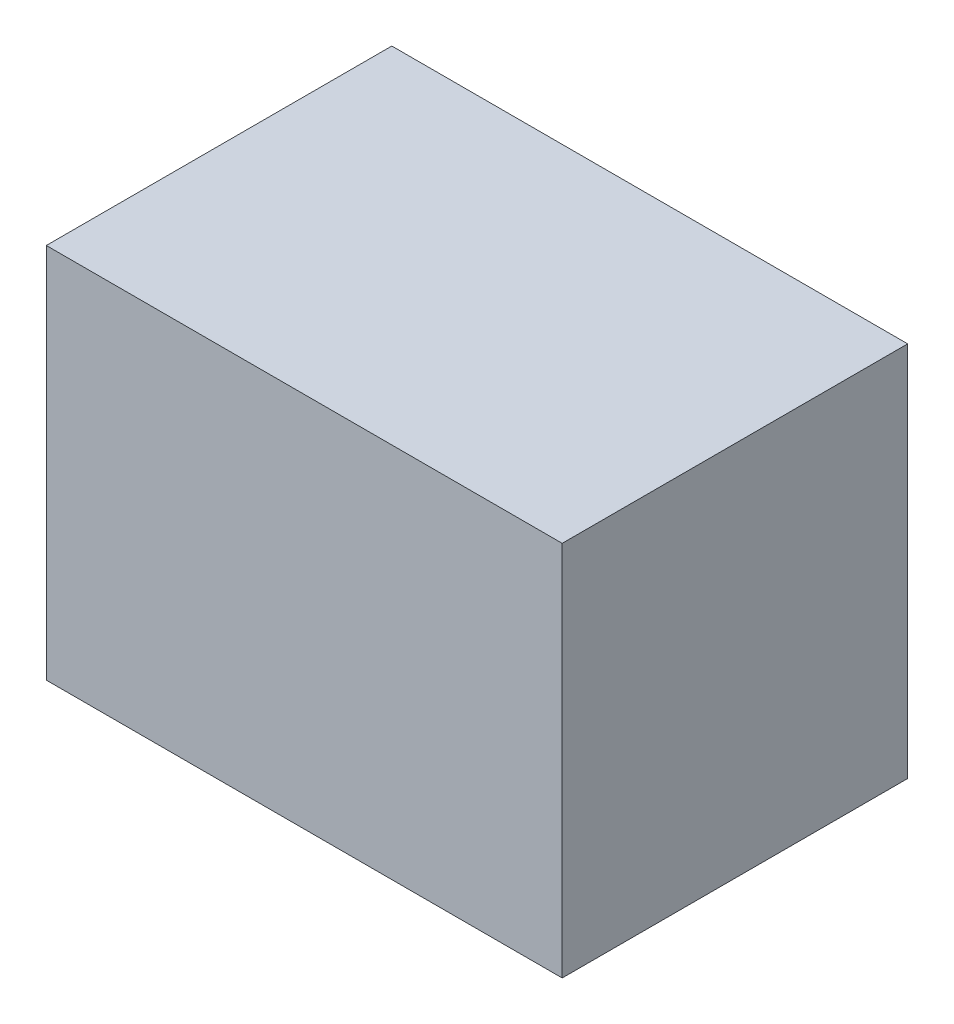
ISO-10303-21;
HEADER;
FILE_DESCRIPTION(('STEP AP214'),'2;1');
FILE_NAME('part.step','',(''),(''),'','','');
FILE_SCHEMA(('AUTOMOTIVE_DESIGN { 1 0 10303 214 1 1 1 1 }'));
ENDSEC;
DATA;
#1=APPLICATION_CONTEXT('core data for automotive mechanical design processes');
#2=APPLICATION_PROTOCOL_DEFINITION('international standard','automotive_design',2000,#1);
#3=PRODUCT_CONTEXT('',#1,'mechanical');
#4=PRODUCT('Part','Part','',(#3));
#5=PRODUCT_RELATED_PRODUCT_CATEGORY('part','',(#4));
#6=PRODUCT_DEFINITION_FORMATION('','',#4);
#7=PRODUCT_DEFINITION_CONTEXT('part definition',#1,'design');
#8=PRODUCT_DEFINITION('design','',#6,#7);
#9=PRODUCT_DEFINITION_SHAPE('','',#8);
#10=(LENGTH_UNIT() NAMED_UNIT(*) SI_UNIT(.MILLI.,.METRE.));
#11=(NAMED_UNIT(*) PLANE_ANGLE_UNIT() SI_UNIT($,.RADIAN.));
#12=(NAMED_UNIT(*) SI_UNIT($,.STERADIAN.) SOLID_ANGLE_UNIT());
#13=UNCERTAINTY_MEASURE_WITH_UNIT(LENGTH_MEASURE(1.E-05),#10,'distance_accuracy_value','');
#14=(GEOMETRIC_REPRESENTATION_CONTEXT(3) GLOBAL_UNCERTAINTY_ASSIGNED_CONTEXT((#13)) GLOBAL_UNIT_ASSIGNED_CONTEXT((#10,
#11,#12)) REPRESENTATION_CONTEXT('',''));
#15=CARTESIAN_POINT('',(0.,0.,0.));
#16=DIRECTION('',(0.,0.,1.));
#17=DIRECTION('',(1.,0.,0.));
#18=AXIS2_PLACEMENT_3D('',#15,#16,#17);
#19=CARTESIAN_POINT('',(-8.24999874,-6.02000066,0.));
#20=DIRECTION('',(-1.,0.,0.));
#21=DIRECTION('',(0.,1.,0.));
#22=AXIS2_PLACEMENT_3D('',#19,#20,#21);
#23=PLANE('',#22);
#24=DIRECTION('',(0.,0.,1.));
#25=VECTOR('',#24,1.);
#26=CARTESIAN_POINT('',(-8.24999874,-6.02000066,0.));
#27=LINE('',#26,#25);
#28=CARTESIAN_POINT('',(-8.24999874,-6.02000066,0.));
#29=VERTEX_POINT('',#28);
#30=CARTESIAN_POINT('',(-8.24999874,-6.02000066,11.05000076));
#31=VERTEX_POINT('',#30);
#32=EDGE_CURVE('E11',#29,#31,#27,.T.);
#33=ORIENTED_EDGE('',*,*,#32,.T.);
#34=DIRECTION('',(0.,1.,0.));
#35=VECTOR('',#34,1.);
#36=CARTESIAN_POINT('',(-8.24999874,-6.02000066,11.05000076));
#37=LINE('',#36,#35);
#38=CARTESIAN_POINT('',(-8.24999874,6.02000066,11.05000076));
#39=VERTEX_POINT('',#38);
#40=EDGE_CURVE('E24',#31,#39,#37,.T.);
#41=ORIENTED_EDGE('',*,*,#40,.T.);
#42=DIRECTION('',(0.,0.,1.));
#43=VECTOR('',#42,1.);
#44=CARTESIAN_POINT('',(-8.24999874,6.02000066,0.));
#45=LINE('',#44,#43);
#46=CARTESIAN_POINT('',(-8.24999874,6.02000066,0.));
#47=VERTEX_POINT('',#46);
#48=EDGE_CURVE('E85',#47,#39,#45,.T.);
#49=ORIENTED_EDGE('',*,*,#48,.F.);
#50=DIRECTION('',(0.,1.,0.));
#51=VECTOR('',#50,1.);
#52=CARTESIAN_POINT('',(-8.24999874,-6.02000066,0.));
#53=LINE('',#52,#51);
#54=EDGE_CURVE('E83',#29,#47,#53,.T.);
#55=ORIENTED_EDGE('',*,*,#54,.F.);
#56=EDGE_LOOP('',(#33,#41,#49,#55));
#57=FACE_BOUND('',#56,.T.);
#58=ADVANCED_FACE('F17',(#57),#23,.T.);
#59=CARTESIAN_POINT('',(-8.24999874,6.02000066,0.));
#60=DIRECTION('',(0.,1.,0.));
#61=DIRECTION('',(1.,0.,0.));
#62=AXIS2_PLACEMENT_3D('',#59,#60,#61);
#63=PLANE('',#62);
#64=ORIENTED_EDGE('',*,*,#48,.T.);
#65=DIRECTION('',(1.,0.,0.));
#66=VECTOR('',#65,1.);
#67=CARTESIAN_POINT('',(-8.24999874,6.02000066,11.05000076));
#68=LINE('',#67,#66);
#69=CARTESIAN_POINT('',(8.25000128,6.02000066,11.05000076));
#70=VERTEX_POINT('',#69);
#71=EDGE_CURVE('E81',#39,#70,#68,.T.);
#72=ORIENTED_EDGE('',*,*,#71,.T.);
#73=DIRECTION('',(0.,0.,1.));
#74=VECTOR('',#73,1.);
#75=CARTESIAN_POINT('',(8.25000128,6.02000066,0.));
#76=LINE('',#75,#74);
#77=CARTESIAN_POINT('',(8.25000128,6.02000066,0.));
#78=VERTEX_POINT('',#77);
#79=EDGE_CURVE('E79',#78,#70,#76,.T.);
#80=ORIENTED_EDGE('',*,*,#79,.F.);
#81=DIRECTION('',(1.,0.,0.));
#82=VECTOR('',#81,1.);
#83=CARTESIAN_POINT('',(-8.24999874,6.02000066,0.));
#84=LINE('',#83,#82);
#85=EDGE_CURVE('E70',#47,#78,#84,.T.);
#86=ORIENTED_EDGE('',*,*,#85,.F.);
#87=EDGE_LOOP('',(#64,#72,#80,#86));
#88=FACE_BOUND('',#87,.T.);
#89=ADVANCED_FACE('F90',(#88),#63,.T.);
#90=CARTESIAN_POINT('',(8.25000128,6.02000066,0.));
#91=DIRECTION('',(1.,0.,0.));
#92=DIRECTION('',(0.,-1.,0.));
#93=AXIS2_PLACEMENT_3D('',#90,#91,#92);
#94=PLANE('',#93);
#95=ORIENTED_EDGE('',*,*,#79,.T.);
#96=DIRECTION('',(0.,-1.,0.));
#97=VECTOR('',#96,1.);
#98=CARTESIAN_POINT('',(8.25000128,6.02000066,11.05000076));
#99=LINE('',#98,#97);
#100=CARTESIAN_POINT('',(8.25000128,-6.02000066,11.05000076));
#101=VERTEX_POINT('',#100);
#102=EDGE_CURVE('E60',#70,#101,#99,.T.);
#103=ORIENTED_EDGE('',*,*,#102,.T.);
#104=DIRECTION('',(0.,0.,1.));
#105=VECTOR('',#104,1.);
#106=CARTESIAN_POINT('',(8.25000128,-6.02000066,0.));
#107=LINE('',#106,#105);
#108=CARTESIAN_POINT('',(8.25000128,-6.02000066,0.));
#109=VERTEX_POINT('',#108);
#110=EDGE_CURVE('E54',#109,#101,#107,.T.);
#111=ORIENTED_EDGE('',*,*,#110,.F.);
#112=DIRECTION('',(0.,-1.,0.));
#113=VECTOR('',#112,1.);
#114=CARTESIAN_POINT('',(8.25000128,6.02000066,0.));
#115=LINE('',#114,#113);
#116=EDGE_CURVE('E58',#78,#109,#115,.T.);
#117=ORIENTED_EDGE('',*,*,#116,.F.);
#118=EDGE_LOOP('',(#95,#103,#111,#117));
#119=FACE_BOUND('',#118,.T.);
#120=ADVANCED_FACE('F57',(#119),#94,.T.);
#121=CARTESIAN_POINT('',(8.25000128,-6.02000066,0.));
#122=DIRECTION('',(0.,-1.,0.));
#123=DIRECTION('',(-1.,0.,0.));
#124=AXIS2_PLACEMENT_3D('',#121,#122,#123);
#125=PLANE('',#124);
#126=ORIENTED_EDGE('',*,*,#110,.T.);
#127=DIRECTION('',(-1.,0.,0.));
#128=VECTOR('',#127,1.);
#129=CARTESIAN_POINT('',(8.25000128,-6.02000066,11.05000076));
#130=LINE('',#129,#128);
#131=EDGE_CURVE('E71',#101,#31,#130,.T.);
#132=ORIENTED_EDGE('',*,*,#131,.T.);
#133=ORIENTED_EDGE('',*,*,#32,.F.);
#134=DIRECTION('',(-1.,0.,0.));
#135=VECTOR('',#134,1.);
#136=CARTESIAN_POINT('',(8.25000128,-6.02000066,0.));
#137=LINE('',#136,#135);
#138=EDGE_CURVE('E68',#109,#29,#137,.T.);
#139=ORIENTED_EDGE('',*,*,#138,.F.);
#140=EDGE_LOOP('',(#126,#132,#133,#139));
#141=FACE_BOUND('',#140,.T.);
#142=ADVANCED_FACE('F73',(#141),#125,.T.);
#143=CARTESIAN_POINT('',(1.26999999902E-06,0.,0.));
#144=DIRECTION('',(0.,0.,-1.));
#145=DIRECTION('',(-1.,0.,0.));
#146=AXIS2_PLACEMENT_3D('',#143,#144,#145);
#147=PLANE('',#146);
#148=ORIENTED_EDGE('',*,*,#54,.T.);
#149=ORIENTED_EDGE('',*,*,#85,.T.);
#150=ORIENTED_EDGE('',*,*,#116,.T.);
#151=ORIENTED_EDGE('',*,*,#138,.T.);
#152=EDGE_LOOP('',(#148,#149,#150,#151));
#153=FACE_BOUND('',#152,.T.);
#154=ADVANCED_FACE('F67',(#153),#147,.T.);
#155=CARTESIAN_POINT('',(1.26999999902E-06,0.,11.05000076));
#156=DIRECTION('',(0.,0.,-1.));
#157=DIRECTION('',(-1.,0.,0.));
#158=AXIS2_PLACEMENT_3D('',#155,#156,#157);
#159=PLANE('',#158);
#160=ORIENTED_EDGE('',*,*,#131,.F.);
#161=ORIENTED_EDGE('',*,*,#102,.F.);
#162=ORIENTED_EDGE('',*,*,#71,.F.);
#163=ORIENTED_EDGE('',*,*,#40,.F.);
#164=EDGE_LOOP('',(#160,#161,#162,#163));
#165=FACE_BOUND('',#164,.T.);
#166=ADVANCED_FACE('F91',(#165),#159,.F.);
#167=CLOSED_SHELL('',(#58,#89,#120,#142,#154,#166));
#168=MANIFOLD_SOLID_BREP('B1',#167);
#169=ADVANCED_BREP_SHAPE_REPRESENTATION('',(#18,#168),#14);
#170=SHAPE_DEFINITION_REPRESENTATION(#9,#169);
ENDSEC;
END-ISO-10303-21;
